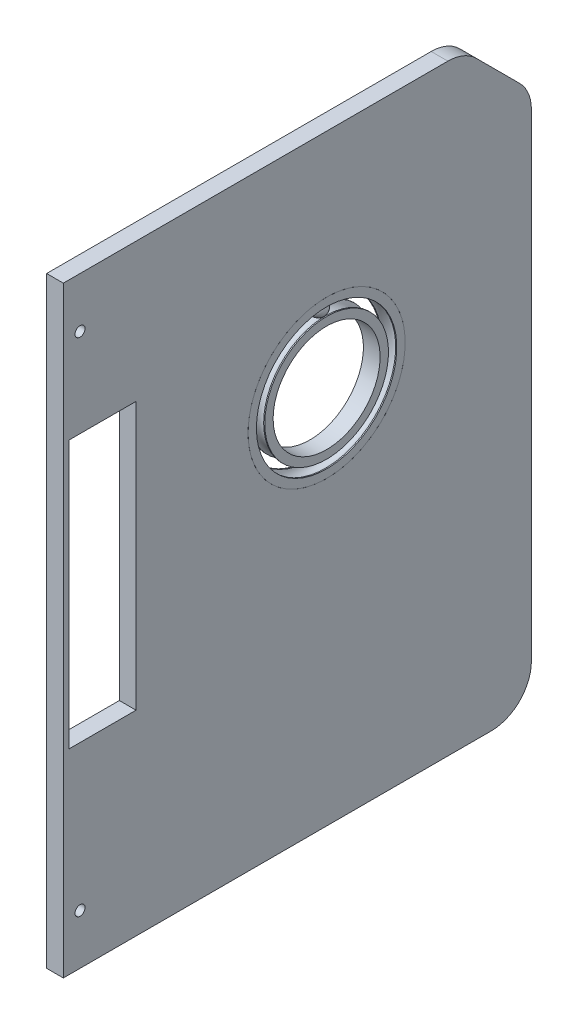
ISO-10303-21;
HEADER;
FILE_DESCRIPTION(('STEP AP214'),'2;1');
FILE_NAME('part.step','',(''),(''),'','','');
FILE_SCHEMA(('AUTOMOTIVE_DESIGN { 1 0 10303 214 1 1 1 1 }'));
ENDSEC;
DATA;
#1=APPLICATION_CONTEXT('core data for automotive mechanical design processes');
#2=APPLICATION_PROTOCOL_DEFINITION('international standard','automotive_design',2000,#1);
#3=PRODUCT_CONTEXT('',#1,'mechanical');
#4=PRODUCT('Part','Part','',(#3));
#5=PRODUCT_RELATED_PRODUCT_CATEGORY('part','',(#4));
#6=PRODUCT_DEFINITION_FORMATION('','',#4);
#7=PRODUCT_DEFINITION_CONTEXT('part definition',#1,'design');
#8=PRODUCT_DEFINITION('design','',#6,#7);
#9=PRODUCT_DEFINITION_SHAPE('','',#8);
#10=(LENGTH_UNIT() NAMED_UNIT(*) SI_UNIT(.MILLI.,.METRE.));
#11=(NAMED_UNIT(*) PLANE_ANGLE_UNIT() SI_UNIT($,.RADIAN.));
#12=(NAMED_UNIT(*) SI_UNIT($,.STERADIAN.) SOLID_ANGLE_UNIT());
#13=UNCERTAINTY_MEASURE_WITH_UNIT(LENGTH_MEASURE(1.E-05),#10,'distance_accuracy_value','');
#14=(GEOMETRIC_REPRESENTATION_CONTEXT(3) GLOBAL_UNCERTAINTY_ASSIGNED_CONTEXT((#13)) GLOBAL_UNIT_ASSIGNED_CONTEXT((#10,
#11,#12)) REPRESENTATION_CONTEXT('',''));
#15=CARTESIAN_POINT('',(0.,0.,0.));
#16=DIRECTION('',(0.,0.,1.));
#17=DIRECTION('',(1.,0.,0.));
#18=AXIS2_PLACEMENT_3D('',#15,#16,#17);
#19=CARTESIAN_POINT('',(2.5,43.25,0.));
#20=DIRECTION('',(1.,0.,0.));
#21=DIRECTION('',(0.,-1.,0.));
#22=AXIS2_PLACEMENT_3D('',#19,#20,#21);
#23=SPHERICAL_SURFACE('',#22,2.39);
#24=CARTESIAN_POINT('',(4.89,43.25,0.));
#25=VERTEX_POINT('',#24);
#26=VERTEX_LOOP('',#25);
#27=FACE_BOUND('',#26,.T.);
#28=ADVANCED_FACE('F42',(#27),#23,.T.);
#29=CLOSED_SHELL('',(#28));
#30=MANIFOLD_SOLID_BREP('B2',#29);
#31=CARTESIAN_POINT('',(0.,42.,0.));
#32=DIRECTION('',(1.,0.,0.));
#33=DIRECTION('',(0.,0.,-1.));
#34=AXIS2_PLACEMENT_3D('',#31,#32,#33);
#35=PLANE('',#34);
#36=CARTESIAN_POINT('',(0.,23.5,0.));
#37=DIRECTION('',(-1.,0.,0.));
#38=DIRECTION('',(0.,0.,1.));
#39=AXIS2_PLACEMENT_3D('',#36,#37,#38);
#40=CIRCLE('',#39,16.);
#41=CARTESIAN_POINT('',(0.,23.5,16.));
#42=VERTEX_POINT('',#41);
#43=EDGE_CURVE('E41',#42,#42,#40,.T.);
#44=ORIENTED_EDGE('',*,*,#43,.F.);
#45=EDGE_LOOP('',(#44));
#46=FACE_BOUND('',#45,.T.);
#47=CARTESIAN_POINT('',(0.,23.5,0.));
#48=DIRECTION('',(-1.,0.,0.));
#49=DIRECTION('',(0.,0.,1.));
#50=AXIS2_PLACEMENT_3D('',#47,#48,#49);
#51=CIRCLE('',#50,18.5);
#52=CARTESIAN_POINT('',(0.,23.5,18.5));
#53=VERTEX_POINT('',#52);
#54=EDGE_CURVE('E85',#53,#53,#51,.T.);
#55=ORIENTED_EDGE('',*,*,#54,.T.);
#56=EDGE_LOOP('',(#55));
#57=FACE_BOUND('',#56,.T.);
#58=ADVANCED_FACE('F63',(#46,#57),#35,.F.);
#59=CARTESIAN_POINT('',(5.91506350946109,23.5,0.));
#60=DIRECTION('',(-1.,0.,0.));
#61=DIRECTION('',(0.,0.,1.));
#62=AXIS2_PLACEMENT_3D('',#59,#60,#61);
#63=CYLINDRICAL_SURFACE('',#62,16.);
#64=CARTESIAN_POINT('',(5.,23.5,0.));
#65=DIRECTION('',(-1.,0.,0.));
#66=DIRECTION('',(0.,0.,1.));
#67=AXIS2_PLACEMENT_3D('',#64,#65,#66);
#68=CIRCLE('',#67,16.);
#69=CARTESIAN_POINT('',(5.,23.5,16.));
#70=VERTEX_POINT('',#69);
#71=EDGE_CURVE('E69',#70,#70,#68,.T.);
#72=ORIENTED_EDGE('',*,*,#71,.F.);
#73=EDGE_LOOP('',(#72));
#74=FACE_BOUND('',#73,.T.);
#75=ORIENTED_EDGE('',*,*,#43,.T.);
#76=EDGE_LOOP('',(#75));
#77=FACE_BOUND('',#76,.T.);
#78=ADVANCED_FACE('F110',(#74,#77),#63,.F.);
#79=CARTESIAN_POINT('',(5.,42.,0.));
#80=DIRECTION('',(-1.,0.,0.));
#81=DIRECTION('',(0.,0.,1.));
#82=AXIS2_PLACEMENT_3D('',#79,#80,#81);
#83=PLANE('',#82);
#84=CARTESIAN_POINT('',(5.,23.5,0.));
#85=DIRECTION('',(-1.,0.,0.));
#86=DIRECTION('',(0.,0.,1.));
#87=AXIS2_PLACEMENT_3D('',#84,#85,#86);
#88=CIRCLE('',#87,18.5);
#89=CARTESIAN_POINT('',(5.,23.5,18.5));
#90=VERTEX_POINT('',#89);
#91=EDGE_CURVE('E73',#90,#90,#88,.T.);
#92=ORIENTED_EDGE('',*,*,#91,.F.);
#93=EDGE_LOOP('',(#92));
#94=FACE_BOUND('',#93,.T.);
#95=ORIENTED_EDGE('',*,*,#71,.T.);
#96=EDGE_LOOP('',(#95));
#97=FACE_BOUND('',#96,.T.);
#98=ADVANCED_FACE('F105',(#94,#97),#83,.F.);
#99=CARTESIAN_POINT('',(5.91506350946109,23.5,0.));
#100=DIRECTION('',(-1.,0.,0.));
#101=DIRECTION('',(0.,0.,1.));
#102=AXIS2_PLACEMENT_3D('',#99,#100,#101);
#103=CYLINDRICAL_SURFACE('',#102,18.5);
#104=CARTESIAN_POINT('',(4.66506350946109,23.5,0.));
#105=DIRECTION('',(-1.,0.,0.));
#106=DIRECTION('',(0.,0.,1.));
#107=AXIS2_PLACEMENT_3D('',#104,#105,#106);
#108=CIRCLE('',#107,18.5);
#109=CARTESIAN_POINT('',(4.66506350946109,23.5,18.5));
#110=VERTEX_POINT('',#109);
#111=EDGE_CURVE('E77',#110,#110,#108,.T.);
#112=ORIENTED_EDGE('',*,*,#111,.F.);
#113=EDGE_LOOP('',(#112));
#114=FACE_BOUND('',#113,.T.);
#115=ORIENTED_EDGE('',*,*,#91,.T.);
#116=EDGE_LOOP('',(#115));
#117=FACE_BOUND('',#116,.T.);
#118=ADVANCED_FACE('F99',(#114,#117),#103,.T.);
#119=CARTESIAN_POINT('',(2.5,23.5,0.));
#120=DIRECTION('',(-1.,0.,0.));
#121=DIRECTION('',(0.,0.,1.));
#122=AXIS2_PLACEMENT_3D('',#119,#120,#121);
#123=TOROIDAL_SURFACE('',#122,19.75,2.5);
#124=CARTESIAN_POINT('',(0.334936490538907,23.5,0.));
#125=DIRECTION('',(-1.,0.,0.));
#126=DIRECTION('',(0.,0.,1.));
#127=AXIS2_PLACEMENT_3D('',#124,#125,#126);
#128=CIRCLE('',#127,18.5);
#129=CARTESIAN_POINT('',(0.334936490538907,23.5,18.5));
#130=VERTEX_POINT('',#129);
#131=EDGE_CURVE('E82',#130,#130,#128,.T.);
#132=ORIENTED_EDGE('',*,*,#131,.F.);
#133=EDGE_LOOP('',(#132));
#134=FACE_BOUND('',#133,.T.);
#135=ORIENTED_EDGE('',*,*,#111,.T.);
#136=EDGE_LOOP('',(#135));
#137=FACE_BOUND('',#136,.T.);
#138=ADVANCED_FACE('F93',(#134,#137),#123,.F.);
#139=CARTESIAN_POINT('',(5.91506350946109,23.5,0.));
#140=DIRECTION('',(-1.,0.,0.));
#141=DIRECTION('',(0.,0.,1.));
#142=AXIS2_PLACEMENT_3D('',#139,#140,#141);
#143=CYLINDRICAL_SURFACE('',#142,18.5);
#144=ORIENTED_EDGE('',*,*,#54,.F.);
#145=EDGE_LOOP('',(#144));
#146=FACE_BOUND('',#145,.T.);
#147=ORIENTED_EDGE('',*,*,#131,.T.);
#148=EDGE_LOOP('',(#147));
#149=FACE_BOUND('',#148,.T.);
#150=ADVANCED_FACE('F90',(#146,#149),#143,.T.);
#151=CLOSED_SHELL('',(#58,#78,#98,#118,#138,#150));
#152=MANIFOLD_SOLID_BREP('B6',#151);
#153=CARTESIAN_POINT('',(5.,47.,0.));
#154=DIRECTION('',(-1.,0.,0.));
#155=DIRECTION('',(0.,0.,1.));
#156=AXIS2_PLACEMENT_3D('',#153,#154,#155);
#157=PLANE('',#156);
#158=CARTESIAN_POINT('',(5.,23.5,0.));
#159=DIRECTION('',(-1.,0.,0.));
#160=DIRECTION('',(0.,0.,1.));
#161=AXIS2_PLACEMENT_3D('',#158,#159,#160);
#162=CIRCLE('',#161,23.5);
#163=CARTESIAN_POINT('',(5.,23.5,23.5));
#164=VERTEX_POINT('',#163);
#165=EDGE_CURVE('E62',#164,#164,#162,.T.);
#166=ORIENTED_EDGE('',*,*,#165,.F.);
#167=EDGE_LOOP('',(#166));
#168=FACE_BOUND('',#167,.T.);
#169=CARTESIAN_POINT('',(5.,23.5,0.));
#170=DIRECTION('',(-1.,0.,0.));
#171=DIRECTION('',(0.,0.,1.));
#172=AXIS2_PLACEMENT_3D('',#169,#170,#171);
#173=CIRCLE('',#172,21.);
#174=CARTESIAN_POINT('',(5.,23.5,21.));
#175=VERTEX_POINT('',#174);
#176=EDGE_CURVE('E186',#175,#175,#173,.T.);
#177=ORIENTED_EDGE('',*,*,#176,.T.);
#178=EDGE_LOOP('',(#177));
#179=FACE_BOUND('',#178,.T.);
#180=ADVANCED_FACE('F164',(#168,#179),#157,.F.);
#181=CARTESIAN_POINT('',(5.91506350946109,23.5,0.));
#182=DIRECTION('',(-1.,0.,0.));
#183=DIRECTION('',(0.,0.,1.));
#184=AXIS2_PLACEMENT_3D('',#181,#182,#183);
#185=CYLINDRICAL_SURFACE('',#184,23.5);
#186=CARTESIAN_POINT('',(0.,23.5,0.));
#187=DIRECTION('',(-1.,0.,0.));
#188=DIRECTION('',(0.,0.,1.));
#189=AXIS2_PLACEMENT_3D('',#186,#187,#188);
#190=CIRCLE('',#189,23.5);
#191=CARTESIAN_POINT('',(0.,23.5,23.5));
#192=VERTEX_POINT('',#191);
#193=EDGE_CURVE('E170',#192,#192,#190,.T.);
#194=ORIENTED_EDGE('',*,*,#193,.F.);
#195=EDGE_LOOP('',(#194));
#196=FACE_BOUND('',#195,.T.);
#197=ORIENTED_EDGE('',*,*,#165,.T.);
#198=EDGE_LOOP('',(#197));
#199=FACE_BOUND('',#198,.T.);
#200=ADVANCED_FACE('F211',(#196,#199),#185,.T.);
#201=CARTESIAN_POINT('',(0.,47.,0.));
#202=DIRECTION('',(1.,0.,0.));
#203=DIRECTION('',(0.,0.,-1.));
#204=AXIS2_PLACEMENT_3D('',#201,#202,#203);
#205=PLANE('',#204);
#206=CARTESIAN_POINT('',(0.,23.5,0.));
#207=DIRECTION('',(-1.,0.,0.));
#208=DIRECTION('',(0.,0.,1.));
#209=AXIS2_PLACEMENT_3D('',#206,#207,#208);
#210=CIRCLE('',#209,21.);
#211=CARTESIAN_POINT('',(0.,23.5,21.));
#212=VERTEX_POINT('',#211);
#213=EDGE_CURVE('E174',#212,#212,#210,.T.);
#214=ORIENTED_EDGE('',*,*,#213,.F.);
#215=EDGE_LOOP('',(#214));
#216=FACE_BOUND('',#215,.T.);
#217=ORIENTED_EDGE('',*,*,#193,.T.);
#218=EDGE_LOOP('',(#217));
#219=FACE_BOUND('',#218,.T.);
#220=ADVANCED_FACE('F206',(#216,#219),#205,.F.);
#221=CARTESIAN_POINT('',(5.91506350946109,23.5,0.));
#222=DIRECTION('',(-1.,0.,0.));
#223=DIRECTION('',(0.,0.,1.));
#224=AXIS2_PLACEMENT_3D('',#221,#222,#223);
#225=CYLINDRICAL_SURFACE('',#224,21.);
#226=CARTESIAN_POINT('',(0.3349364905389,23.5,0.));
#227=DIRECTION('',(-1.,0.,0.));
#228=DIRECTION('',(0.,0.,1.));
#229=AXIS2_PLACEMENT_3D('',#226,#227,#228);
#230=CIRCLE('',#229,21.);
#231=CARTESIAN_POINT('',(0.3349364905389,23.5,21.));
#232=VERTEX_POINT('',#231);
#233=EDGE_CURVE('E178',#232,#232,#230,.T.);
#234=ORIENTED_EDGE('',*,*,#233,.F.);
#235=EDGE_LOOP('',(#234));
#236=FACE_BOUND('',#235,.T.);
#237=ORIENTED_EDGE('',*,*,#213,.T.);
#238=EDGE_LOOP('',(#237));
#239=FACE_BOUND('',#238,.T.);
#240=ADVANCED_FACE('F200',(#236,#239),#225,.F.);
#241=CARTESIAN_POINT('',(2.5,23.5,0.));
#242=DIRECTION('',(-1.,0.,0.));
#243=DIRECTION('',(0.,0.,1.));
#244=AXIS2_PLACEMENT_3D('',#241,#242,#243);
#245=TOROIDAL_SURFACE('',#244,19.75,2.5);
#246=CARTESIAN_POINT('',(4.6650635094611,23.5,0.));
#247=DIRECTION('',(-1.,0.,0.));
#248=DIRECTION('',(0.,0.,1.));
#249=AXIS2_PLACEMENT_3D('',#246,#247,#248);
#250=CIRCLE('',#249,21.);
#251=CARTESIAN_POINT('',(4.6650635094611,23.5,21.));
#252=VERTEX_POINT('',#251);
#253=EDGE_CURVE('E183',#252,#252,#250,.T.);
#254=ORIENTED_EDGE('',*,*,#253,.F.);
#255=EDGE_LOOP('',(#254));
#256=FACE_BOUND('',#255,.T.);
#257=ORIENTED_EDGE('',*,*,#233,.T.);
#258=EDGE_LOOP('',(#257));
#259=FACE_BOUND('',#258,.T.);
#260=ADVANCED_FACE('F194',(#256,#259),#245,.F.);
#261=CARTESIAN_POINT('',(5.91506350946109,23.5,0.));
#262=DIRECTION('',(-1.,0.,0.));
#263=DIRECTION('',(0.,0.,1.));
#264=AXIS2_PLACEMENT_3D('',#261,#262,#263);
#265=CYLINDRICAL_SURFACE('',#264,21.);
#266=ORIENTED_EDGE('',*,*,#176,.F.);
#267=EDGE_LOOP('',(#266));
#268=FACE_BOUND('',#267,.T.);
#269=ORIENTED_EDGE('',*,*,#253,.T.);
#270=EDGE_LOOP('',(#269));
#271=FACE_BOUND('',#270,.T.);
#272=ADVANCED_FACE('F191',(#268,#271),#265,.F.);
#273=CLOSED_SHELL('',(#180,#200,#220,#240,#260,#272));
#274=MANIFOLD_SOLID_BREP('B36',#273);
#275=CARTESIAN_POINT('',(5.,-90.,-61.25));
#276=DIRECTION('',(0.,1.,0.));
#277=DIRECTION('',(0.,0.,1.));
#278=AXIS2_PLACEMENT_3D('',#275,#276,#277);
#279=PLANE('',#278);
#280=DIRECTION('',(0.,0.,-1.));
#281=VECTOR('',#280,1.);
#282=CARTESIAN_POINT('',(0.,-90.,-61.25));
#283=LINE('',#282,#281);
#284=CARTESIAN_POINT('',(0.,-90.,78.75));
#285=VERTEX_POINT('',#284);
#286=CARTESIAN_POINT('',(0.,-90.,-49.25));
#287=VERTEX_POINT('',#286);
#288=EDGE_CURVE('E395',#285,#287,#283,.T.);
#289=ORIENTED_EDGE('',*,*,#288,.T.);
#290=DIRECTION('',(-1.,0.,0.));
#291=VECTOR('',#290,1.);
#292=CARTESIAN_POINT('',(5.,-90.,-49.25));
#293=LINE('',#292,#291);
#294=CARTESIAN_POINT('',(5.,-90.,-49.25));
#295=VERTEX_POINT('',#294);
#296=EDGE_CURVE('E429',#287,#295,#293,.F.);
#297=ORIENTED_EDGE('',*,*,#296,.T.);
#298=DIRECTION('',(0.,0.,-1.));
#299=VECTOR('',#298,1.);
#300=CARTESIAN_POINT('',(5.,-90.,-61.25));
#301=LINE('',#300,#299);
#302=CARTESIAN_POINT('',(5.,-90.,78.75));
#303=VERTEX_POINT('',#302);
#304=EDGE_CURVE('E396',#303,#295,#301,.T.);
#305=ORIENTED_EDGE('',*,*,#304,.F.);
#306=DIRECTION('',(1.,0.,0.));
#307=VECTOR('',#306,1.);
#308=CARTESIAN_POINT('',(0.,-90.,78.75));
#309=LINE('',#308,#307);
#310=EDGE_CURVE('E389',#285,#303,#309,.T.);
#311=ORIENTED_EDGE('',*,*,#310,.F.);
#312=EDGE_LOOP('',(#289,#297,#305,#311));
#313=FACE_BOUND('',#312,.T.);
#314=ADVANCED_FACE('F256',(#313),#279,.F.);
#315=CARTESIAN_POINT('',(5.,-90.,-61.25));
#316=DIRECTION('',(0.,0.,1.));
#317=DIRECTION('',(1.,0.,0.));
#318=AXIS2_PLACEMENT_3D('',#315,#316,#317);
#319=PLANE('',#318);
#320=DIRECTION('',(0.,1.,0.));
#321=VECTOR('',#320,1.);
#322=CARTESIAN_POINT('',(5.,-90.,-61.25));
#323=LINE('',#322,#321);
#324=CARTESIAN_POINT('',(5.,-78.,-61.25));
#325=VERTEX_POINT('',#324);
#326=CARTESIAN_POINT('',(5.,65.0294372515228,-61.25));
#327=VERTEX_POINT('',#326);
#328=EDGE_CURVE('E399',#325,#327,#323,.T.);
#329=ORIENTED_EDGE('',*,*,#328,.F.);
#330=DIRECTION('',(-1.,0.,0.));
#331=VECTOR('',#330,1.);
#332=CARTESIAN_POINT('',(5.,-78.,-61.25));
#333=LINE('',#332,#331);
#334=CARTESIAN_POINT('',(0.,-78.,-61.25));
#335=VERTEX_POINT('',#334);
#336=EDGE_CURVE('E420',#325,#335,#333,.T.);
#337=ORIENTED_EDGE('',*,*,#336,.T.);
#338=DIRECTION('',(0.,1.,0.));
#339=VECTOR('',#338,1.);
#340=CARTESIAN_POINT('',(0.,-90.,-61.25));
#341=LINE('',#340,#339);
#342=CARTESIAN_POINT('',(0.,65.0294372515228,-61.25));
#343=VERTEX_POINT('',#342);
#344=EDGE_CURVE('E408',#335,#343,#341,.T.);
#345=ORIENTED_EDGE('',*,*,#344,.T.);
#346=DIRECTION('',(-1.,0.,0.));
#347=VECTOR('',#346,1.);
#348=CARTESIAN_POINT('',(5.,65.0294372515228,-61.25));
#349=LINE('',#348,#347);
#350=EDGE_CURVE('E417',#343,#327,#349,.F.);
#351=ORIENTED_EDGE('',*,*,#350,.T.);
#352=EDGE_LOOP('',(#329,#337,#345,#351));
#353=FACE_BOUND('',#352,.T.);
#354=ADVANCED_FACE('F452',(#353),#319,.F.);
#355=CARTESIAN_POINT('',(5.,90.,-61.25));
#356=DIRECTION('',(0.,-1.,0.));
#357=DIRECTION('',(0.,0.,-1.));
#358=AXIS2_PLACEMENT_3D('',#355,#356,#357);
#359=PLANE('',#358);
#360=DIRECTION('',(0.,0.,1.));
#361=VECTOR('',#360,1.);
#362=CARTESIAN_POINT('',(5.,90.,-61.25));
#363=LINE('',#362,#361);
#364=CARTESIAN_POINT('',(5.,90.,-36.2794372515228));
#365=VERTEX_POINT('',#364);
#366=CARTESIAN_POINT('',(5.,90.,78.75));
#367=VERTEX_POINT('',#366);
#368=EDGE_CURVE('E403',#365,#367,#363,.T.);
#369=ORIENTED_EDGE('',*,*,#368,.F.);
#370=DIRECTION('',(1.,0.,0.));
#371=VECTOR('',#370,1.);
#372=CARTESIAN_POINT('',(0.,90.,-36.2794372515228));
#373=LINE('',#372,#371);
#374=CARTESIAN_POINT('',(0.,90.,-36.2794372515228));
#375=VERTEX_POINT('',#374);
#376=EDGE_CURVE('E437',#365,#375,#373,.F.);
#377=ORIENTED_EDGE('',*,*,#376,.T.);
#378=DIRECTION('',(0.,0.,1.));
#379=VECTOR('',#378,1.);
#380=CARTESIAN_POINT('',(0.,90.,-61.25));
#381=LINE('',#380,#379);
#382=CARTESIAN_POINT('',(0.,90.,78.75));
#383=VERTEX_POINT('',#382);
#384=EDGE_CURVE('E400',#375,#383,#381,.T.);
#385=ORIENTED_EDGE('',*,*,#384,.T.);
#386=DIRECTION('',(-1.,0.,0.));
#387=VECTOR('',#386,1.);
#388=CARTESIAN_POINT('',(5.,90.,78.75));
#389=LINE('',#388,#387);
#390=EDGE_CURVE('E382',#367,#383,#389,.T.);
#391=ORIENTED_EDGE('',*,*,#390,.F.);
#392=EDGE_LOOP('',(#369,#377,#385,#391));
#393=FACE_BOUND('',#392,.T.);
#394=ADVANCED_FACE('F471',(#393),#359,.F.);
#395=CARTESIAN_POINT('',(5.,0.,0.));
#396=DIRECTION('',(1.,0.,0.));
#397=DIRECTION('',(0.,0.,-1.));
#398=AXIS2_PLACEMENT_3D('',#395,#396,#397);
#399=PLANE('',#398);
#400=CARTESIAN_POINT('',(5.,-75.,73.75));
#401=DIRECTION('',(1.,0.,0.));
#402=DIRECTION('',(0.,0.,-1.));
#403=AXIS2_PLACEMENT_3D('',#400,#401,#402);
#404=CIRCLE('',#403,1.49999999999999);
#405=CARTESIAN_POINT('',(5.,-75.,72.25));
#406=VERTEX_POINT('',#405);
#407=EDGE_CURVE('E661',#406,#406,#404,.T.);
#408=ORIENTED_EDGE('',*,*,#407,.F.);
#409=EDGE_LOOP('',(#408));
#410=FACE_BOUND('',#409,.T.);
#411=CARTESIAN_POINT('',(5.,75.,73.75));
#412=DIRECTION('',(1.,0.,0.));
#413=DIRECTION('',(0.,0.,-1.));
#414=AXIS2_PLACEMENT_3D('',#411,#412,#413);
#415=CIRCLE('',#414,1.49999999999999);
#416=CARTESIAN_POINT('',(5.,75.,72.25));
#417=VERTEX_POINT('',#416);
#418=EDGE_CURVE('E656',#417,#417,#415,.T.);
#419=ORIENTED_EDGE('',*,*,#418,.F.);
#420=EDGE_LOOP('',(#419));
#421=FACE_BOUND('',#420,.T.);
#422=CARTESIAN_POINT('',(5.,23.5,0.));
#423=DIRECTION('',(1.,0.,0.));
#424=DIRECTION('',(0.,0.,-1.));
#425=AXIS2_PLACEMENT_3D('',#422,#423,#424);
#426=CIRCLE('',#425,23.5);
#427=CARTESIAN_POINT('',(5.,23.5,-23.5));
#428=VERTEX_POINT('',#427);
#429=EDGE_CURVE('E366',#428,#428,#426,.T.);
#430=ORIENTED_EDGE('',*,*,#429,.F.);
#431=EDGE_LOOP('',(#430));
#432=FACE_BOUND('',#431,.T.);
#433=DIRECTION('',(0.,0.,1.));
#434=VECTOR('',#433,1.);
#435=CARTESIAN_POINT('',(5.,48.5,0.));
#436=LINE('',#435,#434);
#437=CARTESIAN_POINT('',(5.,48.5,57.));
#438=VERTEX_POINT('',#437);
#439=CARTESIAN_POINT('',(5.,48.5,77.));
#440=VERTEX_POINT('',#439);
#441=EDGE_CURVE('E271',#438,#440,#436,.T.);
#442=ORIENTED_EDGE('',*,*,#441,.F.);
#443=DIRECTION('',(0.,-1.,0.));
#444=VECTOR('',#443,1.);
#445=CARTESIAN_POINT('',(5.,0.,57.));
#446=LINE('',#445,#444);
#447=CARTESIAN_POINT('',(5.,-31.5,57.));
#448=VERTEX_POINT('',#447);
#449=EDGE_CURVE('E360',#438,#448,#446,.T.);
#450=ORIENTED_EDGE('',*,*,#449,.T.);
#451=DIRECTION('',(0.,0.,1.));
#452=VECTOR('',#451,1.);
#453=CARTESIAN_POINT('',(5.,-31.5,0.));
#454=LINE('',#453,#452);
#455=CARTESIAN_POINT('',(5.,-31.5,77.));
#456=VERTEX_POINT('',#455);
#457=EDGE_CURVE('E363',#448,#456,#454,.T.);
#458=ORIENTED_EDGE('',*,*,#457,.T.);
#459=DIRECTION('',(0.,-1.,0.));
#460=VECTOR('',#459,1.);
#461=CARTESIAN_POINT('',(5.,0.,77.));
#462=LINE('',#461,#460);
#463=EDGE_CURVE('E372',#440,#456,#462,.T.);
#464=ORIENTED_EDGE('',*,*,#463,.F.);
#465=EDGE_LOOP('',(#442,#450,#458,#464));
#466=FACE_BOUND('',#465,.T.);
#467=ORIENTED_EDGE('',*,*,#304,.T.);
#468=CARTESIAN_POINT('',(5.,-78.,-49.25));
#469=DIRECTION('',(1.,0.,0.));
#470=DIRECTION('',(0.,0.,-1.));
#471=AXIS2_PLACEMENT_3D('',#468,#469,#470);
#472=CIRCLE('',#471,12.);
#473=EDGE_CURVE('E435',#295,#325,#472,.T.);
#474=ORIENTED_EDGE('',*,*,#473,.T.);
#475=ORIENTED_EDGE('',*,*,#328,.T.);
#476=CARTESIAN_POINT('',(5.,65.0294372515228,-49.25));
#477=DIRECTION('',(1.,0.,0.));
#478=DIRECTION('',(0.,0.,-1.));
#479=AXIS2_PLACEMENT_3D('',#476,#477,#478);
#480=CIRCLE('',#479,12.);
#481=CARTESIAN_POINT('',(5.,73.5147186257614,-57.7352813742386));
#482=VERTEX_POINT('',#481);
#483=EDGE_CURVE('E431',#327,#482,#480,.T.);
#484=ORIENTED_EDGE('',*,*,#483,.T.);
#485=DIRECTION('',(0.,-0.707106781186549,-0.707106781186546));
#486=VECTOR('',#485,1.);
#487=CARTESIAN_POINT('',(5.,65.6249999999998,-65.6250000000001));
#488=LINE('',#487,#486);
#489=CARTESIAN_POINT('',(5.,86.4852813742386,-44.7647186257614));
#490=VERTEX_POINT('',#489);
#491=EDGE_CURVE('E414',#482,#490,#488,.F.);
#492=ORIENTED_EDGE('',*,*,#491,.T.);
#493=CARTESIAN_POINT('',(5.,78.,-36.2794372515228));
#494=DIRECTION('',(1.,0.,0.));
#495=DIRECTION('',(0.,0.,-1.));
#496=AXIS2_PLACEMENT_3D('',#493,#494,#495);
#497=CIRCLE('',#496,12.);
#498=EDGE_CURVE('E433',#490,#365,#497,.T.);
#499=ORIENTED_EDGE('',*,*,#498,.T.);
#500=ORIENTED_EDGE('',*,*,#368,.T.);
#501=DIRECTION('',(0.,1.,0.));
#502=VECTOR('',#501,1.);
#503=CARTESIAN_POINT('',(5.,-90.,78.75));
#504=LINE('',#503,#502);
#505=EDGE_CURVE('E392',#303,#367,#504,.T.);
#506=ORIENTED_EDGE('',*,*,#505,.F.);
#507=EDGE_LOOP('',(#467,#474,#475,#484,#492,#499,#500,#506));
#508=FACE_BOUND('',#507,.T.);
#509=ADVANCED_FACE('F455',(#410,#421,#432,#466,#508),#399,.T.);
#510=CARTESIAN_POINT('',(0.,0.,0.));
#511=DIRECTION('',(1.,0.,0.));
#512=DIRECTION('',(0.,0.,-1.));
#513=AXIS2_PLACEMENT_3D('',#510,#511,#512);
#514=PLANE('',#513);
#515=CARTESIAN_POINT('',(0.,-75.,73.75));
#516=DIRECTION('',(1.,0.,0.));
#517=DIRECTION('',(0.,0.,-1.));
#518=AXIS2_PLACEMENT_3D('',#515,#516,#517);
#519=CIRCLE('',#518,1.5);
#520=CARTESIAN_POINT('',(0.,-75.,72.25));
#521=VERTEX_POINT('',#520);
#522=EDGE_CURVE('E659',#521,#521,#519,.T.);
#523=ORIENTED_EDGE('',*,*,#522,.T.);
#524=EDGE_LOOP('',(#523));
#525=FACE_BOUND('',#524,.T.);
#526=CARTESIAN_POINT('',(0.,75.,73.75));
#527=DIRECTION('',(1.,0.,0.));
#528=DIRECTION('',(0.,0.,-1.));
#529=AXIS2_PLACEMENT_3D('',#526,#527,#528);
#530=CIRCLE('',#529,1.5);
#531=CARTESIAN_POINT('',(0.,75.,72.25));
#532=VERTEX_POINT('',#531);
#533=EDGE_CURVE('E373',#532,#532,#530,.T.);
#534=ORIENTED_EDGE('',*,*,#533,.T.);
#535=EDGE_LOOP('',(#534));
#536=FACE_BOUND('',#535,.T.);
#537=CARTESIAN_POINT('',(0.,23.5,0.));
#538=DIRECTION('',(1.,0.,0.));
#539=DIRECTION('',(0.,0.,-1.));
#540=AXIS2_PLACEMENT_3D('',#537,#538,#539);
#541=CIRCLE('',#540,23.5);
#542=CARTESIAN_POINT('',(0.,23.5,-23.5));
#543=VERTEX_POINT('',#542);
#544=EDGE_CURVE('E386',#543,#543,#541,.T.);
#545=ORIENTED_EDGE('',*,*,#544,.T.);
#546=EDGE_LOOP('',(#545));
#547=FACE_BOUND('',#546,.T.);
#548=DIRECTION('',(0.,-1.,0.));
#549=VECTOR('',#548,1.);
#550=CARTESIAN_POINT('',(0.,0.,57.));
#551=LINE('',#550,#549);
#552=CARTESIAN_POINT('',(0.,48.5,57.));
#553=VERTEX_POINT('',#552);
#554=CARTESIAN_POINT('',(0.,-31.5,57.));
#555=VERTEX_POINT('',#554);
#556=EDGE_CURVE('E349',#553,#555,#551,.T.);
#557=ORIENTED_EDGE('',*,*,#556,.F.);
#558=DIRECTION('',(0.,0.,1.));
#559=VECTOR('',#558,1.);
#560=CARTESIAN_POINT('',(0.,48.5,0.));
#561=LINE('',#560,#559);
#562=CARTESIAN_POINT('',(0.,48.5,77.));
#563=VERTEX_POINT('',#562);
#564=EDGE_CURVE('E346',#553,#563,#561,.T.);
#565=ORIENTED_EDGE('',*,*,#564,.T.);
#566=DIRECTION('',(0.,-1.,0.));
#567=VECTOR('',#566,1.);
#568=CARTESIAN_POINT('',(0.,0.,77.));
#569=LINE('',#568,#567);
#570=CARTESIAN_POINT('',(0.,-31.5,77.));
#571=VERTEX_POINT('',#570);
#572=EDGE_CURVE('E352',#563,#571,#569,.T.);
#573=ORIENTED_EDGE('',*,*,#572,.T.);
#574=DIRECTION('',(0.,0.,1.));
#575=VECTOR('',#574,1.);
#576=CARTESIAN_POINT('',(0.,-31.5,0.));
#577=LINE('',#576,#575);
#578=EDGE_CURVE('E356',#555,#571,#577,.T.);
#579=ORIENTED_EDGE('',*,*,#578,.F.);
#580=EDGE_LOOP('',(#557,#565,#573,#579));
#581=FACE_BOUND('',#580,.T.);
#582=ORIENTED_EDGE('',*,*,#344,.F.);
#583=CARTESIAN_POINT('',(0.,-78.,-49.25));
#584=DIRECTION('',(1.,0.,0.));
#585=DIRECTION('',(0.,0.,-1.));
#586=AXIS2_PLACEMENT_3D('',#583,#584,#585);
#587=CIRCLE('',#586,12.);
#588=EDGE_CURVE('E427',#335,#287,#587,.F.);
#589=ORIENTED_EDGE('',*,*,#588,.T.);
#590=ORIENTED_EDGE('',*,*,#288,.F.);
#591=DIRECTION('',(0.,-1.,0.));
#592=VECTOR('',#591,1.);
#593=CARTESIAN_POINT('',(0.,90.,78.75));
#594=LINE('',#593,#592);
#595=EDGE_CURVE('E385',#383,#285,#594,.T.);
#596=ORIENTED_EDGE('',*,*,#595,.F.);
#597=ORIENTED_EDGE('',*,*,#384,.F.);
#598=CARTESIAN_POINT('',(0.,78.,-36.2794372515228));
#599=DIRECTION('',(1.,0.,0.));
#600=DIRECTION('',(0.,0.,-1.));
#601=AXIS2_PLACEMENT_3D('',#598,#599,#600);
#602=CIRCLE('',#601,12.);
#603=CARTESIAN_POINT('',(0.,86.4852813742386,-44.7647186257614));
#604=VERTEX_POINT('',#603);
#605=EDGE_CURVE('E425',#375,#604,#602,.F.);
#606=ORIENTED_EDGE('',*,*,#605,.T.);
#607=DIRECTION('',(0.,0.707106781186549,0.707106781186546));
#608=VECTOR('',#607,1.);
#609=CARTESIAN_POINT('',(0.,90.,-41.25));
#610=LINE('',#609,#608);
#611=CARTESIAN_POINT('',(0.,73.5147186257614,-57.7352813742386));
#612=VERTEX_POINT('',#611);
#613=EDGE_CURVE('E405',#604,#612,#610,.F.);
#614=ORIENTED_EDGE('',*,*,#613,.T.);
#615=CARTESIAN_POINT('',(0.,65.0294372515228,-49.25));
#616=DIRECTION('',(1.,0.,0.));
#617=DIRECTION('',(0.,0.,-1.));
#618=AXIS2_PLACEMENT_3D('',#615,#616,#617);
#619=CIRCLE('',#618,12.);
#620=EDGE_CURVE('E423',#612,#343,#619,.F.);
#621=ORIENTED_EDGE('',*,*,#620,.T.);
#622=EDGE_LOOP('',(#582,#589,#590,#596,#597,#606,#614,#621));
#623=FACE_BOUND('',#622,.T.);
#624=ADVANCED_FACE('F358',(#525,#536,#547,#581,#623),#514,.F.);
#625=CARTESIAN_POINT('',(5.,90.,-41.25));
#626=DIRECTION('',(0.,-0.707106781186546,0.707106781186549));
#627=DIRECTION('',(-1.,0.,0.));
#628=AXIS2_PLACEMENT_3D('',#625,#626,#627);
#629=PLANE('',#628);
#630=ORIENTED_EDGE('',*,*,#613,.F.);
#631=DIRECTION('',(-1.,0.,0.));
#632=VECTOR('',#631,1.);
#633=CARTESIAN_POINT('',(5.,86.4852813742386,-44.7647186257614));
#634=LINE('',#633,#632);
#635=EDGE_CURVE('E162',#604,#490,#634,.F.);
#636=ORIENTED_EDGE('',*,*,#635,.T.);
#637=ORIENTED_EDGE('',*,*,#491,.F.);
#638=DIRECTION('',(1.,0.,0.));
#639=VECTOR('',#638,1.);
#640=CARTESIAN_POINT('',(0.,73.5147186257614,-57.7352813742386));
#641=LINE('',#640,#639);
#642=EDGE_CURVE('E264',#482,#612,#641,.F.);
#643=ORIENTED_EDGE('',*,*,#642,.T.);
#644=EDGE_LOOP('',(#630,#636,#637,#643));
#645=FACE_BOUND('',#644,.T.);
#646=ADVANCED_FACE('F443',(#645),#629,.F.);
#647=CARTESIAN_POINT('',(5.,-78.,-49.25));
#648=DIRECTION('',(-1.,0.,0.));
#649=DIRECTION('',(0.,0.,1.));
#650=AXIS2_PLACEMENT_3D('',#647,#648,#649);
#651=CYLINDRICAL_SURFACE('',#650,12.);
#652=ORIENTED_EDGE('',*,*,#473,.F.);
#653=ORIENTED_EDGE('',*,*,#296,.F.);
#654=ORIENTED_EDGE('',*,*,#588,.F.);
#655=ORIENTED_EDGE('',*,*,#336,.F.);
#656=EDGE_LOOP('',(#652,#653,#654,#655));
#657=FACE_BOUND('',#656,.T.);
#658=ADVANCED_FACE('F460',(#657),#651,.T.);
#659=CARTESIAN_POINT('',(5.,78.,-36.2794372515228));
#660=DIRECTION('',(-1.,0.,0.));
#661=DIRECTION('',(0.,0.,1.));
#662=AXIS2_PLACEMENT_3D('',#659,#660,#661);
#663=CYLINDRICAL_SURFACE('',#662,12.);
#664=ORIENTED_EDGE('',*,*,#498,.F.);
#665=ORIENTED_EDGE('',*,*,#635,.F.);
#666=ORIENTED_EDGE('',*,*,#605,.F.);
#667=ORIENTED_EDGE('',*,*,#376,.F.);
#668=EDGE_LOOP('',(#664,#665,#666,#667));
#669=FACE_BOUND('',#668,.T.);
#670=ADVANCED_FACE('F473',(#669),#663,.T.);
#671=CARTESIAN_POINT('',(5.,65.0294372515228,-49.25));
#672=DIRECTION('',(1.,0.,0.));
#673=DIRECTION('',(0.,0.,-1.));
#674=AXIS2_PLACEMENT_3D('',#671,#672,#673);
#675=CYLINDRICAL_SURFACE('',#674,12.);
#676=ORIENTED_EDGE('',*,*,#620,.F.);
#677=ORIENTED_EDGE('',*,*,#642,.F.);
#678=ORIENTED_EDGE('',*,*,#483,.F.);
#679=ORIENTED_EDGE('',*,*,#350,.F.);
#680=EDGE_LOOP('',(#676,#677,#678,#679));
#681=FACE_BOUND('',#680,.T.);
#682=ADVANCED_FACE('F258',(#681),#675,.T.);
#683=CARTESIAN_POINT('',(0.,0.,78.75));
#684=DIRECTION('',(0.,0.,1.));
#685=DIRECTION('',(1.,0.,0.));
#686=AXIS2_PLACEMENT_3D('',#683,#684,#685);
#687=PLANE('',#686);
#688=ORIENTED_EDGE('',*,*,#390,.T.);
#689=ORIENTED_EDGE('',*,*,#595,.T.);
#690=ORIENTED_EDGE('',*,*,#310,.T.);
#691=ORIENTED_EDGE('',*,*,#505,.T.);
#692=EDGE_LOOP('',(#688,#689,#690,#691));
#693=FACE_BOUND('',#692,.T.);
#694=ADVANCED_FACE('F465',(#693),#687,.T.);
#695=CARTESIAN_POINT('',(0.,48.5,0.));
#696=DIRECTION('',(0.,1.,0.));
#697=DIRECTION('',(0.,0.,1.));
#698=AXIS2_PLACEMENT_3D('',#695,#696,#697);
#699=PLANE('',#698);
#700=ORIENTED_EDGE('',*,*,#441,.T.);
#701=DIRECTION('',(1.,0.,0.));
#702=VECTOR('',#701,1.);
#703=CARTESIAN_POINT('',(0.,48.5,77.));
#704=LINE('',#703,#702);
#705=EDGE_CURVE('E343',#563,#440,#704,.T.);
#706=ORIENTED_EDGE('',*,*,#705,.F.);
#707=ORIENTED_EDGE('',*,*,#564,.F.);
#708=DIRECTION('',(1.,0.,0.));
#709=VECTOR('',#708,1.);
#710=CARTESIAN_POINT('',(0.,48.5,57.));
#711=LINE('',#710,#709);
#712=EDGE_CURVE('E377',#553,#438,#711,.T.);
#713=ORIENTED_EDGE('',*,*,#712,.T.);
#714=EDGE_LOOP('',(#700,#706,#707,#713));
#715=FACE_BOUND('',#714,.T.);
#716=ADVANCED_FACE('F344',(#715),#699,.F.);
#717=CARTESIAN_POINT('',(0.,0.,57.));
#718=DIRECTION('',(0.,0.,1.));
#719=DIRECTION('',(0.,-1.,0.));
#720=AXIS2_PLACEMENT_3D('',#717,#718,#719);
#721=PLANE('',#720);
#722=ORIENTED_EDGE('',*,*,#449,.F.);
#723=ORIENTED_EDGE('',*,*,#712,.F.);
#724=ORIENTED_EDGE('',*,*,#556,.T.);
#725=DIRECTION('',(1.,0.,0.));
#726=VECTOR('',#725,1.);
#727=CARTESIAN_POINT('',(0.,-31.5,57.));
#728=LINE('',#727,#726);
#729=EDGE_CURVE('E379',#555,#448,#728,.T.);
#730=ORIENTED_EDGE('',*,*,#729,.T.);
#731=EDGE_LOOP('',(#722,#723,#724,#730));
#732=FACE_BOUND('',#731,.T.);
#733=ADVANCED_FACE('F560',(#732),#721,.T.);
#734=CARTESIAN_POINT('',(0.,-31.5,0.));
#735=DIRECTION('',(0.,1.,0.));
#736=DIRECTION('',(0.,0.,1.));
#737=AXIS2_PLACEMENT_3D('',#734,#735,#736);
#738=PLANE('',#737);
#739=ORIENTED_EDGE('',*,*,#457,.F.);
#740=ORIENTED_EDGE('',*,*,#729,.F.);
#741=ORIENTED_EDGE('',*,*,#578,.T.);
#742=DIRECTION('',(1.,0.,0.));
#743=VECTOR('',#742,1.);
#744=CARTESIAN_POINT('',(0.,-31.5,77.));
#745=LINE('',#744,#743);
#746=EDGE_CURVE('E279',#571,#456,#745,.T.);
#747=ORIENTED_EDGE('',*,*,#746,.T.);
#748=EDGE_LOOP('',(#739,#740,#741,#747));
#749=FACE_BOUND('',#748,.T.);
#750=ADVANCED_FACE('F563',(#749),#738,.T.);
#751=CARTESIAN_POINT('',(0.,0.,77.));
#752=DIRECTION('',(0.,0.,1.));
#753=DIRECTION('',(0.,-1.,0.));
#754=AXIS2_PLACEMENT_3D('',#751,#752,#753);
#755=PLANE('',#754);
#756=ORIENTED_EDGE('',*,*,#463,.T.);
#757=ORIENTED_EDGE('',*,*,#746,.F.);
#758=ORIENTED_EDGE('',*,*,#572,.F.);
#759=ORIENTED_EDGE('',*,*,#705,.T.);
#760=EDGE_LOOP('',(#756,#757,#758,#759));
#761=FACE_BOUND('',#760,.T.);
#762=ADVANCED_FACE('F353',(#761),#755,.F.);
#763=CARTESIAN_POINT('',(0.,23.5,0.));
#764=DIRECTION('',(1.,0.,0.));
#765=DIRECTION('',(0.,0.,-1.));
#766=AXIS2_PLACEMENT_3D('',#763,#764,#765);
#767=CYLINDRICAL_SURFACE('',#766,23.5);
#768=ORIENTED_EDGE('',*,*,#544,.F.);
#769=EDGE_LOOP('',(#768));
#770=FACE_BOUND('',#769,.T.);
#771=ORIENTED_EDGE('',*,*,#429,.T.);
#772=EDGE_LOOP('',(#771));
#773=FACE_BOUND('',#772,.T.);
#774=ADVANCED_FACE('F523',(#770,#773),#767,.F.);
#775=CARTESIAN_POINT('',(5.,75.,73.75));
#776=DIRECTION('',(1.,0.,0.));
#777=DIRECTION('',(0.,0.,-1.));
#778=AXIS2_PLACEMENT_3D('',#775,#776,#777);
#779=CYLINDRICAL_SURFACE('',#778,1.49999999999999);
#780=ORIENTED_EDGE('',*,*,#533,.F.);
#781=EDGE_LOOP('',(#780));
#782=FACE_BOUND('',#781,.T.);
#783=ORIENTED_EDGE('',*,*,#418,.T.);
#784=EDGE_LOOP('',(#783));
#785=FACE_BOUND('',#784,.T.);
#786=ADVANCED_FACE('F536',(#782,#785),#779,.F.);
#787=CARTESIAN_POINT('',(5.,-75.,73.75));
#788=DIRECTION('',(1.,0.,0.));
#789=DIRECTION('',(0.,0.,-1.));
#790=AXIS2_PLACEMENT_3D('',#787,#788,#789);
#791=CYLINDRICAL_SURFACE('',#790,1.49999999999999);
#792=ORIENTED_EDGE('',*,*,#522,.F.);
#793=EDGE_LOOP('',(#792));
#794=FACE_BOUND('',#793,.T.);
#795=ORIENTED_EDGE('',*,*,#407,.T.);
#796=EDGE_LOOP('',(#795));
#797=FACE_BOUND('',#796,.T.);
#798=ADVANCED_FACE('F541',(#794,#797),#791,.F.);
#799=CLOSED_SHELL('',(#314,#354,#394,#509,#624,#646,#658,#670,#682,#694,#716,#733,#750,#762,
#774,#786,#798));
#800=MANIFOLD_SOLID_BREP('B57',#799);
#801=ADVANCED_BREP_SHAPE_REPRESENTATION('',(#18,#30,#152,#274,#800),#14);
#802=SHAPE_DEFINITION_REPRESENTATION(#9,#801);
ENDSEC;
END-ISO-10303-21;
